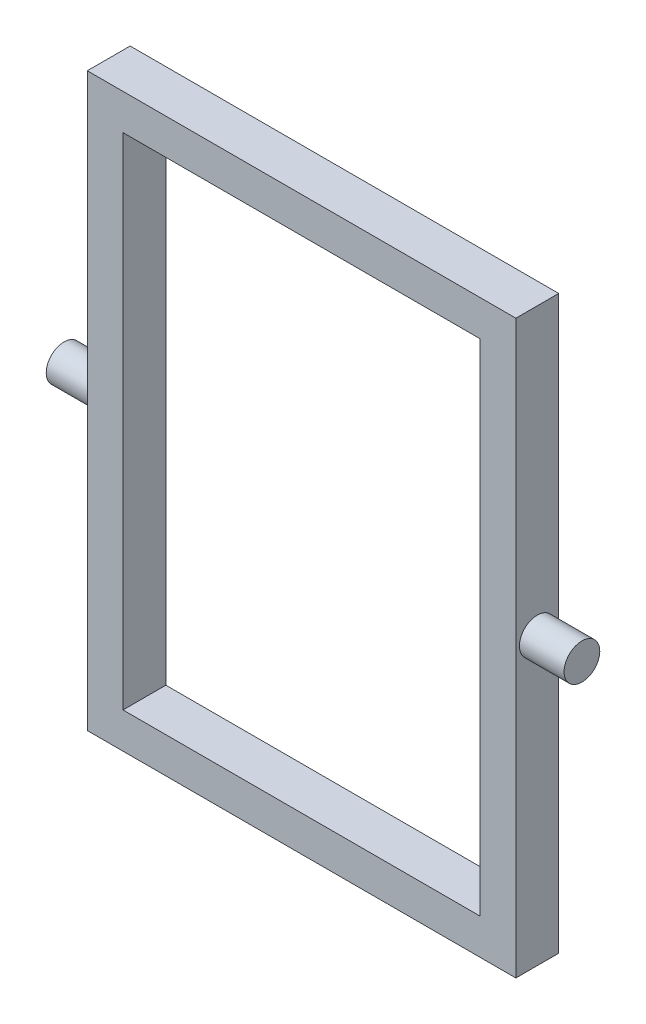
ISO-10303-21;
HEADER;
FILE_DESCRIPTION(('STEP AP214'),'2;1');
FILE_NAME('part.step','',(''),(''),'','','');
FILE_SCHEMA(('AUTOMOTIVE_DESIGN { 1 0 10303 214 1 1 1 1 }'));
ENDSEC;
DATA;
#1=APPLICATION_CONTEXT('core data for automotive mechanical design processes');
#2=APPLICATION_PROTOCOL_DEFINITION('international standard','automotive_design',2000,#1);
#3=PRODUCT_CONTEXT('',#1,'mechanical');
#4=PRODUCT('Part','Part','',(#3));
#5=PRODUCT_RELATED_PRODUCT_CATEGORY('part','',(#4));
#6=PRODUCT_DEFINITION_FORMATION('','',#4);
#7=PRODUCT_DEFINITION_CONTEXT('part definition',#1,'design');
#8=PRODUCT_DEFINITION('design','',#6,#7);
#9=PRODUCT_DEFINITION_SHAPE('','',#8);
#10=(LENGTH_UNIT() NAMED_UNIT(*) SI_UNIT(.MILLI.,.METRE.));
#11=(NAMED_UNIT(*) PLANE_ANGLE_UNIT() SI_UNIT($,.RADIAN.));
#12=(NAMED_UNIT(*) SI_UNIT($,.STERADIAN.) SOLID_ANGLE_UNIT());
#13=UNCERTAINTY_MEASURE_WITH_UNIT(LENGTH_MEASURE(1.E-05),#10,'distance_accuracy_value','');
#14=(GEOMETRIC_REPRESENTATION_CONTEXT(3) GLOBAL_UNCERTAINTY_ASSIGNED_CONTEXT((#13)) GLOBAL_UNIT_ASSIGNED_CONTEXT((#10,
#11,#12)) REPRESENTATION_CONTEXT('',''));
#15=CARTESIAN_POINT('',(0.,0.,0.));
#16=DIRECTION('',(0.,0.,1.));
#17=DIRECTION('',(1.,0.,0.));
#18=AXIS2_PLACEMENT_3D('',#15,#16,#17);
#19=CARTESIAN_POINT('',(300.,400.,-30.));
#20=DIRECTION('',(1.,0.,0.));
#21=DIRECTION('',(0.,1.,0.));
#22=AXIS2_PLACEMENT_3D('',#19,#20,#21);
#23=PLANE('',#22);
#24=CARTESIAN_POINT('',(300.,0.,0.));
#25=DIRECTION('',(1.,0.,0.));
#26=DIRECTION('',(0.,1.,0.));
#27=AXIS2_PLACEMENT_3D('',#24,#25,#26);
#28=CIRCLE('',#27,25.);
#29=CARTESIAN_POINT('',(300.,25.0000000000001,0.));
#30=VERTEX_POINT('',#29);
#31=EDGE_CURVE('E197',#30,#30,#28,.T.);
#32=ORIENTED_EDGE('',*,*,#31,.F.);
#33=EDGE_LOOP('',(#32));
#34=FACE_BOUND('',#33,.T.);
#35=DIRECTION('',(0.,0.,1.));
#36=VECTOR('',#35,1.);
#37=CARTESIAN_POINT('',(300.,400.,-30.));
#38=LINE('',#37,#36);
#39=CARTESIAN_POINT('',(300.,400.,-30.));
#40=VERTEX_POINT('',#39);
#41=CARTESIAN_POINT('',(300.,400.,30.));
#42=VERTEX_POINT('',#41);
#43=EDGE_CURVE('E162',#40,#42,#38,.T.);
#44=ORIENTED_EDGE('',*,*,#43,.T.);
#45=DIRECTION('',(0.,1.,0.));
#46=VECTOR('',#45,1.);
#47=CARTESIAN_POINT('',(300.,400.,30.));
#48=LINE('',#47,#46);
#49=CARTESIAN_POINT('',(300.,-400.,30.));
#50=VERTEX_POINT('',#49);
#51=EDGE_CURVE('E129',#50,#42,#48,.T.);
#52=ORIENTED_EDGE('',*,*,#51,.F.);
#53=DIRECTION('',(0.,0.,1.));
#54=VECTOR('',#53,1.);
#55=CARTESIAN_POINT('',(300.,-400.,-30.));
#56=LINE('',#55,#54);
#57=CARTESIAN_POINT('',(300.,-400.,-30.));
#58=VERTEX_POINT('',#57);
#59=EDGE_CURVE('E40',#58,#50,#56,.T.);
#60=ORIENTED_EDGE('',*,*,#59,.F.);
#61=DIRECTION('',(0.,1.,0.));
#62=VECTOR('',#61,1.);
#63=CARTESIAN_POINT('',(300.,400.,-30.));
#64=LINE('',#63,#62);
#65=EDGE_CURVE('E148',#58,#40,#64,.T.);
#66=ORIENTED_EDGE('',*,*,#65,.T.);
#67=EDGE_LOOP('',(#44,#52,#60,#66));
#68=FACE_BOUND('',#67,.T.);
#69=ADVANCED_FACE('F33',(#34,#68),#23,.T.);
#70=CARTESIAN_POINT('',(-300.,-400.,-30.));
#71=DIRECTION('',(0.,-1.,0.));
#72=DIRECTION('',(0.,0.,-1.));
#73=AXIS2_PLACEMENT_3D('',#70,#71,#72);
#74=PLANE('',#73);
#75=ORIENTED_EDGE('',*,*,#59,.T.);
#76=DIRECTION('',(1.,0.,0.));
#77=VECTOR('',#76,1.);
#78=CARTESIAN_POINT('',(-300.,-400.,30.));
#79=LINE('',#78,#77);
#80=CARTESIAN_POINT('',(-300.,-400.,30.));
#81=VERTEX_POINT('',#80);
#82=EDGE_CURVE('E138',#81,#50,#79,.T.);
#83=ORIENTED_EDGE('',*,*,#82,.F.);
#84=DIRECTION('',(0.,0.,1.));
#85=VECTOR('',#84,1.);
#86=CARTESIAN_POINT('',(-300.,-400.,-30.));
#87=LINE('',#86,#85);
#88=CARTESIAN_POINT('',(-300.,-400.,-30.));
#89=VERTEX_POINT('',#88);
#90=EDGE_CURVE('E164',#89,#81,#87,.T.);
#91=ORIENTED_EDGE('',*,*,#90,.F.);
#92=DIRECTION('',(1.,0.,0.));
#93=VECTOR('',#92,1.);
#94=CARTESIAN_POINT('',(-300.,-400.,-30.));
#95=LINE('',#94,#93);
#96=EDGE_CURVE('E159',#89,#58,#95,.T.);
#97=ORIENTED_EDGE('',*,*,#96,.T.);
#98=EDGE_LOOP('',(#75,#83,#91,#97));
#99=FACE_BOUND('',#98,.T.);
#100=ADVANCED_FACE('F175',(#99),#74,.T.);
#101=CARTESIAN_POINT('',(-300.,400.,-30.));
#102=DIRECTION('',(-1.,0.,0.));
#103=DIRECTION('',(0.,-1.,0.));
#104=AXIS2_PLACEMENT_3D('',#101,#102,#103);
#105=PLANE('',#104);
#106=CARTESIAN_POINT('',(-300.,0.,0.));
#107=DIRECTION('',(-1.,0.,0.));
#108=DIRECTION('',(0.,-1.,0.));
#109=AXIS2_PLACEMENT_3D('',#106,#107,#108);
#110=CIRCLE('',#109,25.);
#111=CARTESIAN_POINT('',(-300.,-24.9999999999999,0.));
#112=VERTEX_POINT('',#111);
#113=EDGE_CURVE('E11',#112,#112,#110,.T.);
#114=ORIENTED_EDGE('',*,*,#113,.F.);
#115=EDGE_LOOP('',(#114));
#116=FACE_BOUND('',#115,.T.);
#117=ORIENTED_EDGE('',*,*,#90,.T.);
#118=DIRECTION('',(0.,-1.,0.));
#119=VECTOR('',#118,1.);
#120=CARTESIAN_POINT('',(-300.,400.,30.));
#121=LINE('',#120,#119);
#122=CARTESIAN_POINT('',(-300.,400.,30.));
#123=VERTEX_POINT('',#122);
#124=EDGE_CURVE('E135',#123,#81,#121,.T.);
#125=ORIENTED_EDGE('',*,*,#124,.F.);
#126=DIRECTION('',(0.,0.,1.));
#127=VECTOR('',#126,1.);
#128=CARTESIAN_POINT('',(-300.,400.,-30.));
#129=LINE('',#128,#127);
#130=CARTESIAN_POINT('',(-300.,400.,-30.));
#131=VERTEX_POINT('',#130);
#132=EDGE_CURVE('E166',#131,#123,#129,.T.);
#133=ORIENTED_EDGE('',*,*,#132,.F.);
#134=DIRECTION('',(0.,-1.,0.));
#135=VECTOR('',#134,1.);
#136=CARTESIAN_POINT('',(-300.,400.,-30.));
#137=LINE('',#136,#135);
#138=EDGE_CURVE('E156',#131,#89,#137,.T.);
#139=ORIENTED_EDGE('',*,*,#138,.T.);
#140=EDGE_LOOP('',(#117,#125,#133,#139));
#141=FACE_BOUND('',#140,.T.);
#142=ADVANCED_FACE('F181',(#116,#141),#105,.T.);
#143=CARTESIAN_POINT('',(-300.,400.,-30.));
#144=DIRECTION('',(0.,1.,0.));
#145=DIRECTION('',(0.,0.,1.));
#146=AXIS2_PLACEMENT_3D('',#143,#144,#145);
#147=PLANE('',#146);
#148=ORIENTED_EDGE('',*,*,#132,.T.);
#149=DIRECTION('',(-1.,0.,0.));
#150=VECTOR('',#149,1.);
#151=CARTESIAN_POINT('',(-300.,400.,30.));
#152=LINE('',#151,#150);
#153=EDGE_CURVE('E132',#42,#123,#152,.T.);
#154=ORIENTED_EDGE('',*,*,#153,.F.);
#155=ORIENTED_EDGE('',*,*,#43,.F.);
#156=DIRECTION('',(-1.,0.,0.));
#157=VECTOR('',#156,1.);
#158=CARTESIAN_POINT('',(-300.,400.,-30.));
#159=LINE('',#158,#157);
#160=EDGE_CURVE('E153',#40,#131,#159,.T.);
#161=ORIENTED_EDGE('',*,*,#160,.T.);
#162=EDGE_LOOP('',(#148,#154,#155,#161));
#163=FACE_BOUND('',#162,.T.);
#164=ADVANCED_FACE('F170',(#163),#147,.T.);
#165=CARTESIAN_POINT('',(0.,0.,-30.));
#166=DIRECTION('',(0.,0.,1.));
#167=DIRECTION('',(1.,0.,0.));
#168=AXIS2_PLACEMENT_3D('',#165,#166,#167);
#169=PLANE('',#168);
#170=DIRECTION('',(1.,0.,0.));
#171=VECTOR('',#170,1.);
#172=CARTESIAN_POINT('',(-250.,-350.,-30.));
#173=LINE('',#172,#171);
#174=CARTESIAN_POINT('',(-250.,-350.,-30.));
#175=VERTEX_POINT('',#174);
#176=CARTESIAN_POINT('',(250.,-350.,-30.));
#177=VERTEX_POINT('',#176);
#178=EDGE_CURVE('E109',#175,#177,#173,.T.);
#179=ORIENTED_EDGE('',*,*,#178,.T.);
#180=DIRECTION('',(0.,1.,0.));
#181=VECTOR('',#180,1.);
#182=CARTESIAN_POINT('',(250.,350.,-30.));
#183=LINE('',#182,#181);
#184=CARTESIAN_POINT('',(250.,350.,-30.));
#185=VERTEX_POINT('',#184);
#186=EDGE_CURVE('E141',#177,#185,#183,.T.);
#187=ORIENTED_EDGE('',*,*,#186,.T.);
#188=DIRECTION('',(-1.,0.,0.));
#189=VECTOR('',#188,1.);
#190=CARTESIAN_POINT('',(-250.,350.,-30.));
#191=LINE('',#190,#189);
#192=CARTESIAN_POINT('',(-250.,350.,-30.));
#193=VERTEX_POINT('',#192);
#194=EDGE_CURVE('E104',#185,#193,#191,.T.);
#195=ORIENTED_EDGE('',*,*,#194,.T.);
#196=DIRECTION('',(0.,-1.,0.));
#197=VECTOR('',#196,1.);
#198=CARTESIAN_POINT('',(-250.,350.,-30.));
#199=LINE('',#198,#197);
#200=EDGE_CURVE('E47',#193,#175,#199,.T.);
#201=ORIENTED_EDGE('',*,*,#200,.T.);
#202=EDGE_LOOP('',(#179,#187,#195,#201));
#203=FACE_BOUND('',#202,.T.);
#204=ORIENTED_EDGE('',*,*,#65,.F.);
#205=ORIENTED_EDGE('',*,*,#96,.F.);
#206=ORIENTED_EDGE('',*,*,#138,.F.);
#207=ORIENTED_EDGE('',*,*,#160,.F.);
#208=EDGE_LOOP('',(#204,#205,#206,#207));
#209=FACE_BOUND('',#208,.T.);
#210=ADVANCED_FACE('F179',(#203,#209),#169,.F.);
#211=CARTESIAN_POINT('',(250.,350.,-30.));
#212=DIRECTION('',(1.,0.,0.));
#213=DIRECTION('',(0.,1.,0.));
#214=AXIS2_PLACEMENT_3D('',#211,#212,#213);
#215=PLANE('',#214);
#216=DIRECTION('',(0.,0.,1.));
#217=VECTOR('',#216,1.);
#218=CARTESIAN_POINT('',(250.,-350.,-30.));
#219=LINE('',#218,#217);
#220=CARTESIAN_POINT('',(250.,-350.,30.));
#221=VERTEX_POINT('',#220);
#222=EDGE_CURVE('E114',#177,#221,#219,.T.);
#223=ORIENTED_EDGE('',*,*,#222,.T.);
#224=DIRECTION('',(0.,1.,0.));
#225=VECTOR('',#224,1.);
#226=CARTESIAN_POINT('',(250.,350.,30.));
#227=LINE('',#226,#225);
#228=CARTESIAN_POINT('',(250.,350.,30.));
#229=VERTEX_POINT('',#228);
#230=EDGE_CURVE('E112',#221,#229,#227,.T.);
#231=ORIENTED_EDGE('',*,*,#230,.T.);
#232=DIRECTION('',(0.,0.,1.));
#233=VECTOR('',#232,1.);
#234=CARTESIAN_POINT('',(250.,350.,-30.));
#235=LINE('',#234,#233);
#236=EDGE_CURVE('E97',#185,#229,#235,.T.);
#237=ORIENTED_EDGE('',*,*,#236,.F.);
#238=ORIENTED_EDGE('',*,*,#186,.F.);
#239=EDGE_LOOP('',(#223,#231,#237,#238));
#240=FACE_BOUND('',#239,.T.);
#241=ADVANCED_FACE('F113',(#240),#215,.F.);
#242=CARTESIAN_POINT('',(-250.,-350.,-30.));
#243=DIRECTION('',(0.,-1.,0.));
#244=DIRECTION('',(0.,0.,-1.));
#245=AXIS2_PLACEMENT_3D('',#242,#243,#244);
#246=PLANE('',#245);
#247=DIRECTION('',(0.,0.,1.));
#248=VECTOR('',#247,1.);
#249=CARTESIAN_POINT('',(-250.,-350.,-30.));
#250=LINE('',#249,#248);
#251=CARTESIAN_POINT('',(-250.,-350.,30.));
#252=VERTEX_POINT('',#251);
#253=EDGE_CURVE('E149',#175,#252,#250,.T.);
#254=ORIENTED_EDGE('',*,*,#253,.T.);
#255=DIRECTION('',(1.,0.,0.));
#256=VECTOR('',#255,1.);
#257=CARTESIAN_POINT('',(-250.,-350.,30.));
#258=LINE('',#257,#256);
#259=EDGE_CURVE('E124',#252,#221,#258,.T.);
#260=ORIENTED_EDGE('',*,*,#259,.T.);
#261=ORIENTED_EDGE('',*,*,#222,.F.);
#262=ORIENTED_EDGE('',*,*,#178,.F.);
#263=EDGE_LOOP('',(#254,#260,#261,#262));
#264=FACE_BOUND('',#263,.T.);
#265=ADVANCED_FACE('F227',(#264),#246,.F.);
#266=CARTESIAN_POINT('',(-250.,350.,-30.));
#267=DIRECTION('',(-1.,0.,0.));
#268=DIRECTION('',(0.,-1.,0.));
#269=AXIS2_PLACEMENT_3D('',#266,#267,#268);
#270=PLANE('',#269);
#271=DIRECTION('',(0.,0.,1.));
#272=VECTOR('',#271,1.);
#273=CARTESIAN_POINT('',(-250.,350.,-30.));
#274=LINE('',#273,#272);
#275=CARTESIAN_POINT('',(-250.,350.,30.));
#276=VERTEX_POINT('',#275);
#277=EDGE_CURVE('E108',#193,#276,#274,.T.);
#278=ORIENTED_EDGE('',*,*,#277,.T.);
#279=DIRECTION('',(0.,-1.,0.));
#280=VECTOR('',#279,1.);
#281=CARTESIAN_POINT('',(-250.,350.,30.));
#282=LINE('',#281,#280);
#283=EDGE_CURVE('E122',#276,#252,#282,.T.);
#284=ORIENTED_EDGE('',*,*,#283,.T.);
#285=ORIENTED_EDGE('',*,*,#253,.F.);
#286=ORIENTED_EDGE('',*,*,#200,.F.);
#287=EDGE_LOOP('',(#278,#284,#285,#286));
#288=FACE_BOUND('',#287,.T.);
#289=ADVANCED_FACE('F230',(#288),#270,.F.);
#290=CARTESIAN_POINT('',(-250.,350.,-30.));
#291=DIRECTION('',(0.,1.,0.));
#292=DIRECTION('',(0.,0.,1.));
#293=AXIS2_PLACEMENT_3D('',#290,#291,#292);
#294=PLANE('',#293);
#295=ORIENTED_EDGE('',*,*,#236,.T.);
#296=DIRECTION('',(-1.,0.,0.));
#297=VECTOR('',#296,1.);
#298=CARTESIAN_POINT('',(-250.,350.,30.));
#299=LINE('',#298,#297);
#300=EDGE_CURVE('E101',#229,#276,#299,.T.);
#301=ORIENTED_EDGE('',*,*,#300,.T.);
#302=ORIENTED_EDGE('',*,*,#277,.F.);
#303=ORIENTED_EDGE('',*,*,#194,.F.);
#304=EDGE_LOOP('',(#295,#301,#302,#303));
#305=FACE_BOUND('',#304,.T.);
#306=ADVANCED_FACE('F99',(#305),#294,.F.);
#307=CARTESIAN_POINT('',(0.,0.,30.));
#308=DIRECTION('',(0.,0.,1.));
#309=DIRECTION('',(1.,0.,0.));
#310=AXIS2_PLACEMENT_3D('',#307,#308,#309);
#311=PLANE('',#310);
#312=ORIENTED_EDGE('',*,*,#51,.T.);
#313=ORIENTED_EDGE('',*,*,#153,.T.);
#314=ORIENTED_EDGE('',*,*,#124,.T.);
#315=ORIENTED_EDGE('',*,*,#82,.T.);
#316=EDGE_LOOP('',(#312,#313,#314,#315));
#317=FACE_BOUND('',#316,.T.);
#318=ORIENTED_EDGE('',*,*,#300,.F.);
#319=ORIENTED_EDGE('',*,*,#230,.F.);
#320=ORIENTED_EDGE('',*,*,#259,.F.);
#321=ORIENTED_EDGE('',*,*,#283,.F.);
#322=EDGE_LOOP('',(#318,#319,#320,#321));
#323=FACE_BOUND('',#322,.T.);
#324=ADVANCED_FACE('F120',(#317,#323),#311,.T.);
#325=CARTESIAN_POINT('',(362.5,0.,0.));
#326=DIRECTION('',(-1.,0.,0.));
#327=DIRECTION('',(0.,-1.,0.));
#328=AXIS2_PLACEMENT_3D('',#325,#326,#327);
#329=CYLINDRICAL_SURFACE('',#328,25.);
#330=CARTESIAN_POINT('',(362.5,0.,0.));
#331=DIRECTION('',(1.,0.,0.));
#332=DIRECTION('',(0.,1.,0.));
#333=AXIS2_PLACEMENT_3D('',#330,#331,#332);
#334=CIRCLE('',#333,25.);
#335=CARTESIAN_POINT('',(362.5,25.0000000000001,0.));
#336=VERTEX_POINT('',#335);
#337=EDGE_CURVE('E118',#336,#336,#334,.T.);
#338=ORIENTED_EDGE('',*,*,#337,.F.);
#339=EDGE_LOOP('',(#338));
#340=FACE_BOUND('',#339,.T.);
#341=ORIENTED_EDGE('',*,*,#31,.T.);
#342=EDGE_LOOP('',(#341));
#343=FACE_BOUND('',#342,.T.);
#344=ADVANCED_FACE('F220',(#340,#343),#329,.T.);
#345=CARTESIAN_POINT('',(362.5,0.,0.));
#346=DIRECTION('',(1.,0.,0.));
#347=DIRECTION('',(0.,1.,0.));
#348=AXIS2_PLACEMENT_3D('',#345,#346,#347);
#349=PLANE('',#348);
#350=ORIENTED_EDGE('',*,*,#337,.T.);
#351=EDGE_LOOP('',(#350));
#352=FACE_BOUND('',#351,.T.);
#353=ADVANCED_FACE('F215',(#352),#349,.T.);
#354=CARTESIAN_POINT('',(-362.5,0.,0.));
#355=DIRECTION('',(1.,0.,0.));
#356=DIRECTION('',(0.,1.,0.));
#357=AXIS2_PLACEMENT_3D('',#354,#355,#356);
#358=CYLINDRICAL_SURFACE('',#357,25.);
#359=CARTESIAN_POINT('',(-362.5,0.,0.));
#360=DIRECTION('',(1.,0.,0.));
#361=DIRECTION('',(0.,1.,0.));
#362=AXIS2_PLACEMENT_3D('',#359,#360,#361);
#363=CIRCLE('',#362,25.);
#364=CARTESIAN_POINT('',(-362.5,25.0000000000001,0.));
#365=VERTEX_POINT('',#364);
#366=EDGE_CURVE('E199',#365,#365,#363,.T.);
#367=ORIENTED_EDGE('',*,*,#366,.T.);
#368=EDGE_LOOP('',(#367));
#369=FACE_BOUND('',#368,.T.);
#370=ORIENTED_EDGE('',*,*,#113,.T.);
#371=EDGE_LOOP('',(#370));
#372=FACE_BOUND('',#371,.T.);
#373=ADVANCED_FACE('F206',(#369,#372),#358,.T.);
#374=CARTESIAN_POINT('',(-362.5,0.,0.));
#375=DIRECTION('',(-1.,0.,0.));
#376=DIRECTION('',(0.,1.,0.));
#377=AXIS2_PLACEMENT_3D('',#374,#375,#376);
#378=PLANE('',#377);
#379=ORIENTED_EDGE('',*,*,#366,.F.);
#380=EDGE_LOOP('',(#379));
#381=FACE_BOUND('',#380,.T.);
#382=ADVANCED_FACE('F209',(#381),#378,.T.);
#383=CLOSED_SHELL('',(#69,#100,#142,#164,#210,#241,#265,#289,#306,#324,#344,#353,#373,#382));
#384=MANIFOLD_SOLID_BREP('B2',#383);
#385=ADVANCED_BREP_SHAPE_REPRESENTATION('',(#18,#384),#14);
#386=SHAPE_DEFINITION_REPRESENTATION(#9,#385);
ENDSEC;
END-ISO-10303-21;
